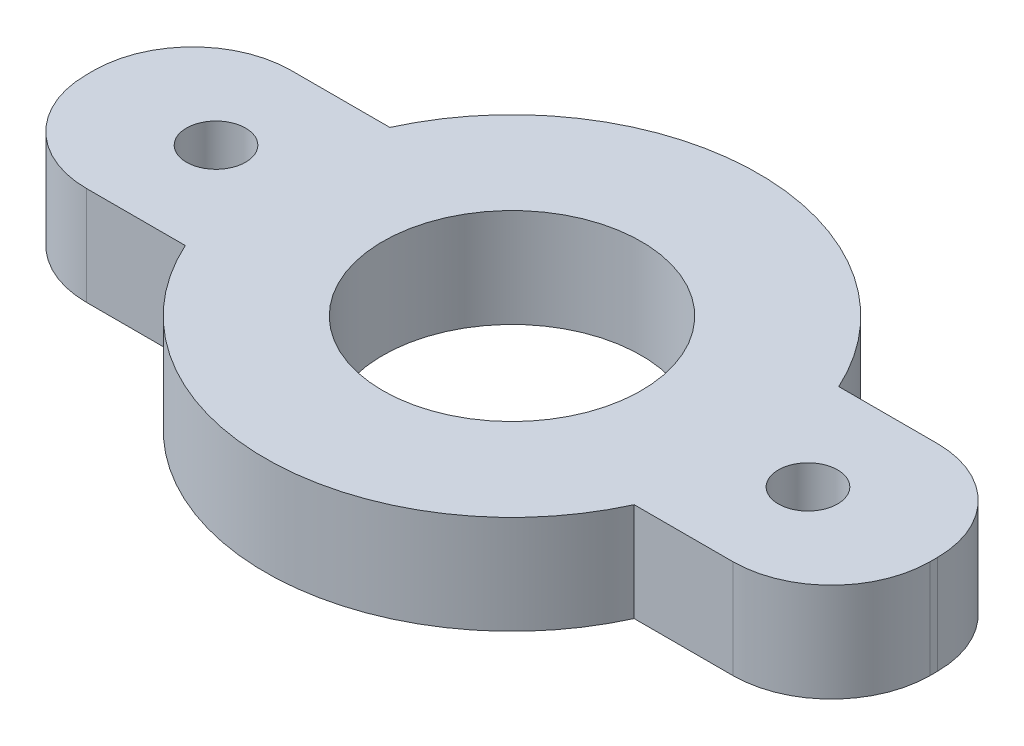
ISO-10303-21;
HEADER;
FILE_DESCRIPTION(('STEP AP214'),'2;1');
FILE_NAME('part.step','',(''),(''),'','','');
FILE_SCHEMA(('AUTOMOTIVE_DESIGN { 1 0 10303 214 1 1 1 1 }'));
ENDSEC;
DATA;
#1=APPLICATION_CONTEXT('core data for automotive mechanical design processes');
#2=APPLICATION_PROTOCOL_DEFINITION('international standard','automotive_design',2000,#1);
#3=PRODUCT_CONTEXT('',#1,'mechanical');
#4=PRODUCT('Part','Part','',(#3));
#5=PRODUCT_RELATED_PRODUCT_CATEGORY('part','',(#4));
#6=PRODUCT_DEFINITION_FORMATION('','',#4);
#7=PRODUCT_DEFINITION_CONTEXT('part definition',#1,'design');
#8=PRODUCT_DEFINITION('design','',#6,#7);
#9=PRODUCT_DEFINITION_SHAPE('','',#8);
#10=(LENGTH_UNIT() NAMED_UNIT(*) SI_UNIT(.MILLI.,.METRE.));
#11=(NAMED_UNIT(*) PLANE_ANGLE_UNIT() SI_UNIT($,.RADIAN.));
#12=(NAMED_UNIT(*) SI_UNIT($,.STERADIAN.) SOLID_ANGLE_UNIT());
#13=UNCERTAINTY_MEASURE_WITH_UNIT(LENGTH_MEASURE(1.E-05),#10,'distance_accuracy_value','');
#14=(GEOMETRIC_REPRESENTATION_CONTEXT(3) GLOBAL_UNCERTAINTY_ASSIGNED_CONTEXT((#13)) GLOBAL_UNIT_ASSIGNED_CONTEXT((#10,
#11,#12)) REPRESENTATION_CONTEXT('',''));
#15=CARTESIAN_POINT('',(0.,0.,0.));
#16=DIRECTION('',(0.,0.,1.));
#17=DIRECTION('',(1.,0.,0.));
#18=AXIS2_PLACEMENT_3D('',#15,#16,#17);
#19=CARTESIAN_POINT('',(0.,5.,0.));
#20=DIRECTION('',(0.,1.,0.));
#21=DIRECTION('',(0.,0.,1.));
#22=AXIS2_PLACEMENT_3D('',#19,#20,#21);
#23=PLANE('',#22);
#24=CARTESIAN_POINT('',(-15.,5.,0.));
#25=DIRECTION('',(0.,1.,0.));
#26=DIRECTION('',(0.,0.,1.));
#27=AXIS2_PLACEMENT_3D('',#24,#25,#26);
#28=CIRCLE('',#27,1.5);
#29=CARTESIAN_POINT('',(-15.,5.,1.5));
#30=VERTEX_POINT('',#29);
#31=EDGE_CURVE('E285',#30,#30,#28,.T.);
#32=ORIENTED_EDGE('',*,*,#31,.F.);
#33=EDGE_LOOP('',(#32));
#34=FACE_BOUND('',#33,.T.);
#35=CARTESIAN_POINT('',(0.,5.,0.));
#36=DIRECTION('',(0.,1.,0.));
#37=DIRECTION('',(0.,0.,1.));
#38=AXIS2_PLACEMENT_3D('',#35,#36,#37);
#39=CIRCLE('',#38,12.5);
#40=CARTESIAN_POINT('',(-11.3744844310577,5.,5.18373455412462));
#41=VERTEX_POINT('',#40);
#42=CARTESIAN_POINT('',(11.3744844310577,5.,5.18373455412462));
#43=VERTEX_POINT('',#42);
#44=EDGE_CURVE('E175',#41,#43,#39,.T.);
#45=ORIENTED_EDGE('',*,*,#44,.T.);
#46=DIRECTION('',(1.,0.,0.));
#47=VECTOR('',#46,1.);
#48=CARTESIAN_POINT('',(16.3744844310577,5.,5.18373455412462));
#49=LINE('',#48,#47);
#50=CARTESIAN_POINT('',(16.3744844310577,5.,5.18373455412462));
#51=VERTEX_POINT('',#50);
#52=EDGE_CURVE('E103',#43,#51,#49,.T.);
#53=ORIENTED_EDGE('',*,*,#52,.T.);
#54=CARTESIAN_POINT('',(16.3744844310577,5.,0.18373455412462));
#55=DIRECTION('',(0.,1.,0.));
#56=DIRECTION('',(0.,0.,-1.));
#57=AXIS2_PLACEMENT_3D('',#54,#55,#56);
#58=CIRCLE('',#57,5.);
#59=CARTESIAN_POINT('',(21.3744844310577,5.,0.183734554124619));
#60=VERTEX_POINT('',#59);
#61=EDGE_CURVE('E202',#51,#60,#58,.T.);
#62=ORIENTED_EDGE('',*,*,#61,.T.);
#63=DIRECTION('',(0.,0.,-1.));
#64=VECTOR('',#63,1.);
#65=CARTESIAN_POINT('',(21.3744844310577,5.,0.18373455412462));
#66=LINE('',#65,#64);
#67=CARTESIAN_POINT('',(21.3744844310577,5.,-0.183734554124614));
#68=VERTEX_POINT('',#67);
#69=EDGE_CURVE('E221',#60,#68,#66,.T.);
#70=ORIENTED_EDGE('',*,*,#69,.T.);
#71=CARTESIAN_POINT('',(16.3744844310577,5.,-0.183734554124614));
#72=DIRECTION('',(0.,1.,0.));
#73=DIRECTION('',(0.,0.,1.));
#74=AXIS2_PLACEMENT_3D('',#71,#72,#73);
#75=CIRCLE('',#74,5.);
#76=CARTESIAN_POINT('',(16.3744844310577,5.,-5.18373455412461));
#77=VERTEX_POINT('',#76);
#78=EDGE_CURVE('E218',#68,#77,#75,.T.);
#79=ORIENTED_EDGE('',*,*,#78,.T.);
#80=DIRECTION('',(-1.,0.,0.));
#81=VECTOR('',#80,1.);
#82=CARTESIAN_POINT('',(16.3744844310577,5.,-5.18373455412461));
#83=LINE('',#82,#81);
#84=CARTESIAN_POINT('',(11.3744844310577,5.,-5.18373455412462));
#85=VERTEX_POINT('',#84);
#86=EDGE_CURVE('E220',#77,#85,#83,.T.);
#87=ORIENTED_EDGE('',*,*,#86,.T.);
#88=CARTESIAN_POINT('',(0.,5.,0.));
#89=DIRECTION('',(0.,1.,0.));
#90=DIRECTION('',(0.,0.,1.));
#91=AXIS2_PLACEMENT_3D('',#88,#89,#90);
#92=CIRCLE('',#91,12.5);
#93=CARTESIAN_POINT('',(-11.3744844310577,5.,-5.18373455412462));
#94=VERTEX_POINT('',#93);
#95=EDGE_CURVE('E223',#85,#94,#92,.T.);
#96=ORIENTED_EDGE('',*,*,#95,.T.);
#97=DIRECTION('',(-1.,0.,0.));
#98=VECTOR('',#97,1.);
#99=CARTESIAN_POINT('',(-11.3744844310577,5.,-5.18373455412462));
#100=LINE('',#99,#98);
#101=CARTESIAN_POINT('',(-16.3744844310577,5.,-5.18373455412462));
#102=VERTEX_POINT('',#101);
#103=EDGE_CURVE('E229',#94,#102,#100,.T.);
#104=ORIENTED_EDGE('',*,*,#103,.T.);
#105=CARTESIAN_POINT('',(-16.3744844310577,5.,-0.183734554124623));
#106=DIRECTION('',(0.,1.,0.));
#107=DIRECTION('',(0.,0.,1.));
#108=AXIS2_PLACEMENT_3D('',#105,#106,#107);
#109=CIRCLE('',#108,5.);
#110=CARTESIAN_POINT('',(-21.3744844310577,5.,-0.183734554124624));
#111=VERTEX_POINT('',#110);
#112=EDGE_CURVE('E134',#102,#111,#109,.T.);
#113=ORIENTED_EDGE('',*,*,#112,.T.);
#114=DIRECTION('',(0.,0.,1.));
#115=VECTOR('',#114,1.);
#116=CARTESIAN_POINT('',(-21.3744844310577,5.,0.183734554124623));
#117=LINE('',#116,#115);
#118=CARTESIAN_POINT('',(-21.3744844310577,5.,0.183734554124623));
#119=VERTEX_POINT('',#118);
#120=EDGE_CURVE('E128',#111,#119,#117,.T.);
#121=ORIENTED_EDGE('',*,*,#120,.T.);
#122=CARTESIAN_POINT('',(-16.3744844310577,5.,0.183734554124623));
#123=DIRECTION('',(0.,1.,0.));
#124=DIRECTION('',(0.,0.,1.));
#125=AXIS2_PLACEMENT_3D('',#122,#123,#124);
#126=CIRCLE('',#125,5.);
#127=CARTESIAN_POINT('',(-16.3744844310577,5.,5.18373455412462));
#128=VERTEX_POINT('',#127);
#129=EDGE_CURVE('E132',#119,#128,#126,.T.);
#130=ORIENTED_EDGE('',*,*,#129,.T.);
#131=DIRECTION('',(1.,0.,0.));
#132=VECTOR('',#131,1.);
#133=CARTESIAN_POINT('',(-11.3744844310577,5.,5.18373455412462));
#134=LINE('',#133,#132);
#135=EDGE_CURVE('E48',#128,#41,#134,.T.);
#136=ORIENTED_EDGE('',*,*,#135,.T.);
#137=EDGE_LOOP('',(#45,#53,#62,#70,#79,#87,#96,#104,#113,#121,#130,#136));
#138=FACE_BOUND('',#137,.T.);
#139=CARTESIAN_POINT('',(0.,5.,0.));
#140=DIRECTION('',(0.,1.,0.));
#141=DIRECTION('',(0.,0.,1.));
#142=AXIS2_PLACEMENT_3D('',#139,#140,#141);
#143=CIRCLE('',#142,6.55);
#144=CARTESIAN_POINT('',(0.,5.,6.55));
#145=VERTEX_POINT('',#144);
#146=EDGE_CURVE('E156',#145,#145,#143,.T.);
#147=ORIENTED_EDGE('',*,*,#146,.F.);
#148=EDGE_LOOP('',(#147));
#149=FACE_BOUND('',#148,.T.);
#150=CARTESIAN_POINT('',(15.,5.,0.));
#151=DIRECTION('',(0.,1.,0.));
#152=DIRECTION('',(0.,0.,1.));
#153=AXIS2_PLACEMENT_3D('',#150,#151,#152);
#154=CIRCLE('',#153,1.5);
#155=CARTESIAN_POINT('',(15.,5.,1.5));
#156=VERTEX_POINT('',#155);
#157=EDGE_CURVE('E276',#156,#156,#154,.T.);
#158=ORIENTED_EDGE('',*,*,#157,.F.);
#159=EDGE_LOOP('',(#158));
#160=FACE_BOUND('',#159,.T.);
#161=ADVANCED_FACE('F31',(#34,#138,#149,#160),#23,.T.);
#162=CARTESIAN_POINT('',(0.,0.,0.));
#163=DIRECTION('',(0.,1.,0.));
#164=DIRECTION('',(0.,0.,1.));
#165=AXIS2_PLACEMENT_3D('',#162,#163,#164);
#166=PLANE('',#165);
#167=CARTESIAN_POINT('',(-15.,0.,0.));
#168=DIRECTION('',(0.,1.,0.));
#169=DIRECTION('',(0.,0.,1.));
#170=AXIS2_PLACEMENT_3D('',#167,#168,#169);
#171=CIRCLE('',#170,1.5);
#172=CARTESIAN_POINT('',(-15.,0.,1.5));
#173=VERTEX_POINT('',#172);
#174=EDGE_CURVE('E282',#173,#173,#171,.T.);
#175=ORIENTED_EDGE('',*,*,#174,.T.);
#176=EDGE_LOOP('',(#175));
#177=FACE_BOUND('',#176,.T.);
#178=CARTESIAN_POINT('',(0.,0.,0.));
#179=DIRECTION('',(0.,1.,0.));
#180=DIRECTION('',(0.,0.,1.));
#181=AXIS2_PLACEMENT_3D('',#178,#179,#180);
#182=CIRCLE('',#181,12.5);
#183=CARTESIAN_POINT('',(-11.3744844310577,0.,5.18373455412462));
#184=VERTEX_POINT('',#183);
#185=CARTESIAN_POINT('',(11.3744844310577,0.,5.18373455412462));
#186=VERTEX_POINT('',#185);
#187=EDGE_CURVE('E152',#184,#186,#182,.T.);
#188=ORIENTED_EDGE('',*,*,#187,.F.);
#189=DIRECTION('',(1.,0.,0.));
#190=VECTOR('',#189,1.);
#191=CARTESIAN_POINT('',(-11.3744844310577,0.,5.18373455412462));
#192=LINE('',#191,#190);
#193=CARTESIAN_POINT('',(-16.3744844310577,0.,5.18373455412462));
#194=VERTEX_POINT('',#193);
#195=EDGE_CURVE('E95',#194,#184,#192,.T.);
#196=ORIENTED_EDGE('',*,*,#195,.F.);
#197=CARTESIAN_POINT('',(-16.3744844310577,0.,0.183734554124623));
#198=DIRECTION('',(0.,1.,0.));
#199=DIRECTION('',(0.,0.,1.));
#200=AXIS2_PLACEMENT_3D('',#197,#198,#199);
#201=CIRCLE('',#200,5.);
#202=CARTESIAN_POINT('',(-21.3744844310577,0.,0.183734554124623));
#203=VERTEX_POINT('',#202);
#204=EDGE_CURVE('E89',#203,#194,#201,.T.);
#205=ORIENTED_EDGE('',*,*,#204,.F.);
#206=DIRECTION('',(0.,0.,1.));
#207=VECTOR('',#206,1.);
#208=CARTESIAN_POINT('',(-21.3744844310577,0.,0.183734554124623));
#209=LINE('',#208,#207);
#210=CARTESIAN_POINT('',(-21.3744844310577,0.,-0.183734554124624));
#211=VERTEX_POINT('',#210);
#212=EDGE_CURVE('E142',#211,#203,#209,.T.);
#213=ORIENTED_EDGE('',*,*,#212,.F.);
#214=CARTESIAN_POINT('',(-16.3744844310577,0.,-0.183734554124623));
#215=DIRECTION('',(0.,1.,0.));
#216=DIRECTION('',(0.,0.,1.));
#217=AXIS2_PLACEMENT_3D('',#214,#215,#216);
#218=CIRCLE('',#217,5.);
#219=CARTESIAN_POINT('',(-16.3744844310577,0.,-5.18373455412462));
#220=VERTEX_POINT('',#219);
#221=EDGE_CURVE('E170',#220,#211,#218,.T.);
#222=ORIENTED_EDGE('',*,*,#221,.F.);
#223=DIRECTION('',(-1.,0.,0.));
#224=VECTOR('',#223,1.);
#225=CARTESIAN_POINT('',(-11.3744844310577,0.,-5.18373455412462));
#226=LINE('',#225,#224);
#227=CARTESIAN_POINT('',(-11.3744844310577,0.,-5.18373455412462));
#228=VERTEX_POINT('',#227);
#229=EDGE_CURVE('E168',#228,#220,#226,.T.);
#230=ORIENTED_EDGE('',*,*,#229,.F.);
#231=CARTESIAN_POINT('',(0.,0.,0.));
#232=DIRECTION('',(0.,1.,0.));
#233=DIRECTION('',(0.,0.,1.));
#234=AXIS2_PLACEMENT_3D('',#231,#232,#233);
#235=CIRCLE('',#234,12.5);
#236=CARTESIAN_POINT('',(11.3744844310577,0.,-5.18373455412462));
#237=VERTEX_POINT('',#236);
#238=EDGE_CURVE('E166',#237,#228,#235,.T.);
#239=ORIENTED_EDGE('',*,*,#238,.F.);
#240=DIRECTION('',(-1.,0.,0.));
#241=VECTOR('',#240,1.);
#242=CARTESIAN_POINT('',(16.3744844310577,0.,-5.18373455412461));
#243=LINE('',#242,#241);
#244=CARTESIAN_POINT('',(16.3744844310577,0.,-5.18373455412461));
#245=VERTEX_POINT('',#244);
#246=EDGE_CURVE('E164',#245,#237,#243,.T.);
#247=ORIENTED_EDGE('',*,*,#246,.F.);
#248=CARTESIAN_POINT('',(16.3744844310577,0.,-0.183734554124614));
#249=DIRECTION('',(0.,1.,0.));
#250=DIRECTION('',(0.,0.,1.));
#251=AXIS2_PLACEMENT_3D('',#248,#249,#250);
#252=CIRCLE('',#251,5.);
#253=CARTESIAN_POINT('',(21.3744844310577,0.,-0.183734554124614));
#254=VERTEX_POINT('',#253);
#255=EDGE_CURVE('E162',#254,#245,#252,.T.);
#256=ORIENTED_EDGE('',*,*,#255,.F.);
#257=DIRECTION('',(0.,0.,-1.));
#258=VECTOR('',#257,1.);
#259=CARTESIAN_POINT('',(21.3744844310577,0.,0.18373455412462));
#260=LINE('',#259,#258);
#261=CARTESIAN_POINT('',(21.3744844310577,0.,0.183734554124619));
#262=VERTEX_POINT('',#261);
#263=EDGE_CURVE('E160',#262,#254,#260,.T.);
#264=ORIENTED_EDGE('',*,*,#263,.F.);
#265=CARTESIAN_POINT('',(16.3744844310577,0.,0.18373455412462));
#266=DIRECTION('',(0.,1.,0.));
#267=DIRECTION('',(0.,0.,-1.));
#268=AXIS2_PLACEMENT_3D('',#265,#266,#267);
#269=CIRCLE('',#268,5.);
#270=CARTESIAN_POINT('',(16.3744844310577,0.,5.18373455412462));
#271=VERTEX_POINT('',#270);
#272=EDGE_CURVE('E158',#271,#262,#269,.T.);
#273=ORIENTED_EDGE('',*,*,#272,.F.);
#274=DIRECTION('',(1.,0.,0.));
#275=VECTOR('',#274,1.);
#276=CARTESIAN_POINT('',(16.3744844310577,0.,5.18373455412462));
#277=LINE('',#276,#275);
#278=EDGE_CURVE('E155',#186,#271,#277,.T.);
#279=ORIENTED_EDGE('',*,*,#278,.F.);
#280=EDGE_LOOP('',(#188,#196,#205,#213,#222,#230,#239,#247,#256,#264,#273,#279));
#281=FACE_BOUND('',#280,.T.);
#282=CARTESIAN_POINT('',(0.,0.,0.));
#283=DIRECTION('',(0.,1.,0.));
#284=DIRECTION('',(0.,0.,1.));
#285=AXIS2_PLACEMENT_3D('',#282,#283,#284);
#286=CIRCLE('',#285,6.55);
#287=CARTESIAN_POINT('',(0.,0.,6.55));
#288=VERTEX_POINT('',#287);
#289=EDGE_CURVE('E288',#288,#288,#286,.T.);
#290=ORIENTED_EDGE('',*,*,#289,.T.);
#291=EDGE_LOOP('',(#290));
#292=FACE_BOUND('',#291,.T.);
#293=CARTESIAN_POINT('',(15.,0.,0.));
#294=DIRECTION('',(0.,1.,0.));
#295=DIRECTION('',(0.,0.,1.));
#296=AXIS2_PLACEMENT_3D('',#293,#294,#295);
#297=CIRCLE('',#296,1.5);
#298=CARTESIAN_POINT('',(15.,0.,1.5));
#299=VERTEX_POINT('',#298);
#300=EDGE_CURVE('E279',#299,#299,#297,.T.);
#301=ORIENTED_EDGE('',*,*,#300,.T.);
#302=EDGE_LOOP('',(#301));
#303=FACE_BOUND('',#302,.T.);
#304=ADVANCED_FACE('F206',(#177,#281,#292,#303),#166,.F.);
#305=CARTESIAN_POINT('',(0.,5.,0.));
#306=DIRECTION('',(0.,-1.,0.));
#307=DIRECTION('',(0.,0.,-1.));
#308=AXIS2_PLACEMENT_3D('',#305,#306,#307);
#309=CYLINDRICAL_SURFACE('',#308,12.5);
#310=ORIENTED_EDGE('',*,*,#187,.T.);
#311=DIRECTION('',(0.,-1.,0.));
#312=VECTOR('',#311,1.);
#313=CARTESIAN_POINT('',(11.3744844310577,5.,5.18373455412462));
#314=LINE('',#313,#312);
#315=EDGE_CURVE('E11',#43,#186,#314,.T.);
#316=ORIENTED_EDGE('',*,*,#315,.F.);
#317=ORIENTED_EDGE('',*,*,#44,.F.);
#318=DIRECTION('',(0.,-1.,0.));
#319=VECTOR('',#318,1.);
#320=CARTESIAN_POINT('',(-11.3744844310577,5.,5.18373455412462));
#321=LINE('',#320,#319);
#322=EDGE_CURVE('E148',#41,#184,#321,.T.);
#323=ORIENTED_EDGE('',*,*,#322,.T.);
#324=EDGE_LOOP('',(#310,#316,#317,#323));
#325=FACE_BOUND('',#324,.T.);
#326=ADVANCED_FACE('F33',(#325),#309,.T.);
#327=CARTESIAN_POINT('',(16.3744844310577,5.,5.18373455412462));
#328=DIRECTION('',(0.,0.,-1.));
#329=DIRECTION('',(-1.,0.,0.));
#330=AXIS2_PLACEMENT_3D('',#327,#328,#329);
#331=PLANE('',#330);
#332=ORIENTED_EDGE('',*,*,#278,.T.);
#333=DIRECTION('',(0.,-1.,0.));
#334=VECTOR('',#333,1.);
#335=CARTESIAN_POINT('',(16.3744844310577,5.,5.18373455412462));
#336=LINE('',#335,#334);
#337=EDGE_CURVE('E40',#51,#271,#336,.T.);
#338=ORIENTED_EDGE('',*,*,#337,.F.);
#339=ORIENTED_EDGE('',*,*,#52,.F.);
#340=ORIENTED_EDGE('',*,*,#315,.T.);
#341=EDGE_LOOP('',(#332,#338,#339,#340));
#342=FACE_BOUND('',#341,.T.);
#343=ADVANCED_FACE('F389',(#342),#331,.F.);
#344=CARTESIAN_POINT('',(16.3744844310577,5.,0.18373455412462));
#345=DIRECTION('',(0.,-1.,0.));
#346=DIRECTION('',(0.,0.,-1.));
#347=AXIS2_PLACEMENT_3D('',#344,#345,#346);
#348=CYLINDRICAL_SURFACE('',#347,5.);
#349=ORIENTED_EDGE('',*,*,#272,.T.);
#350=DIRECTION('',(0.,-1.,0.));
#351=VECTOR('',#350,1.);
#352=CARTESIAN_POINT('',(21.3744844310577,5.,0.183734554124619));
#353=LINE('',#352,#351);
#354=EDGE_CURVE('E194',#60,#262,#353,.T.);
#355=ORIENTED_EDGE('',*,*,#354,.F.);
#356=ORIENTED_EDGE('',*,*,#61,.F.);
#357=ORIENTED_EDGE('',*,*,#337,.T.);
#358=EDGE_LOOP('',(#349,#355,#356,#357));
#359=FACE_BOUND('',#358,.T.);
#360=ADVANCED_FACE('F200',(#359),#348,.T.);
#361=CARTESIAN_POINT('',(21.3744844310577,5.,0.18373455412462));
#362=DIRECTION('',(-1.,0.,0.));
#363=DIRECTION('',(0.,0.,1.));
#364=AXIS2_PLACEMENT_3D('',#361,#362,#363);
#365=PLANE('',#364);
#366=ORIENTED_EDGE('',*,*,#263,.T.);
#367=DIRECTION('',(0.,-1.,0.));
#368=VECTOR('',#367,1.);
#369=CARTESIAN_POINT('',(21.3744844310577,5.,-0.183734554124614));
#370=LINE('',#369,#368);
#371=EDGE_CURVE('E191',#68,#254,#370,.T.);
#372=ORIENTED_EDGE('',*,*,#371,.F.);
#373=ORIENTED_EDGE('',*,*,#69,.F.);
#374=ORIENTED_EDGE('',*,*,#354,.T.);
#375=EDGE_LOOP('',(#366,#372,#373,#374));
#376=FACE_BOUND('',#375,.T.);
#377=ADVANCED_FACE('F212',(#376),#365,.F.);
#378=CARTESIAN_POINT('',(16.3744844310577,5.,-0.183734554124614));
#379=DIRECTION('',(0.,-1.,0.));
#380=DIRECTION('',(0.,0.,-1.));
#381=AXIS2_PLACEMENT_3D('',#378,#379,#380);
#382=CYLINDRICAL_SURFACE('',#381,5.);
#383=ORIENTED_EDGE('',*,*,#255,.T.);
#384=DIRECTION('',(0.,-1.,0.));
#385=VECTOR('',#384,1.);
#386=CARTESIAN_POINT('',(16.3744844310577,5.,-5.18373455412461));
#387=LINE('',#386,#385);
#388=EDGE_CURVE('E188',#77,#245,#387,.T.);
#389=ORIENTED_EDGE('',*,*,#388,.F.);
#390=ORIENTED_EDGE('',*,*,#78,.F.);
#391=ORIENTED_EDGE('',*,*,#371,.T.);
#392=EDGE_LOOP('',(#383,#389,#390,#391));
#393=FACE_BOUND('',#392,.T.);
#394=ADVANCED_FACE('F216',(#393),#382,.T.);
#395=CARTESIAN_POINT('',(16.3744844310577,5.,-5.18373455412461));
#396=DIRECTION('',(0.,0.,1.));
#397=DIRECTION('',(1.,0.,0.));
#398=AXIS2_PLACEMENT_3D('',#395,#396,#397);
#399=PLANE('',#398);
#400=ORIENTED_EDGE('',*,*,#246,.T.);
#401=DIRECTION('',(0.,-1.,0.));
#402=VECTOR('',#401,1.);
#403=CARTESIAN_POINT('',(11.3744844310577,5.,-5.18373455412462));
#404=LINE('',#403,#402);
#405=EDGE_CURVE('E185',#85,#237,#404,.T.);
#406=ORIENTED_EDGE('',*,*,#405,.F.);
#407=ORIENTED_EDGE('',*,*,#86,.F.);
#408=ORIENTED_EDGE('',*,*,#388,.T.);
#409=EDGE_LOOP('',(#400,#406,#407,#408));
#410=FACE_BOUND('',#409,.T.);
#411=ADVANCED_FACE('F354',(#410),#399,.F.);
#412=CARTESIAN_POINT('',(0.,5.,0.));
#413=DIRECTION('',(0.,-1.,0.));
#414=DIRECTION('',(0.,0.,-1.));
#415=AXIS2_PLACEMENT_3D('',#412,#413,#414);
#416=CYLINDRICAL_SURFACE('',#415,12.5);
#417=ORIENTED_EDGE('',*,*,#238,.T.);
#418=DIRECTION('',(0.,-1.,0.));
#419=VECTOR('',#418,1.);
#420=CARTESIAN_POINT('',(-11.3744844310577,5.,-5.18373455412462));
#421=LINE('',#420,#419);
#422=EDGE_CURVE('E182',#94,#228,#421,.T.);
#423=ORIENTED_EDGE('',*,*,#422,.F.);
#424=ORIENTED_EDGE('',*,*,#95,.F.);
#425=ORIENTED_EDGE('',*,*,#405,.T.);
#426=EDGE_LOOP('',(#417,#423,#424,#425));
#427=FACE_BOUND('',#426,.T.);
#428=ADVANCED_FACE('F345',(#427),#416,.T.);
#429=CARTESIAN_POINT('',(-11.3744844310577,5.,-5.18373455412462));
#430=DIRECTION('',(0.,0.,1.));
#431=DIRECTION('',(1.,0.,0.));
#432=AXIS2_PLACEMENT_3D('',#429,#430,#431);
#433=PLANE('',#432);
#434=ORIENTED_EDGE('',*,*,#229,.T.);
#435=DIRECTION('',(0.,-1.,0.));
#436=VECTOR('',#435,1.);
#437=CARTESIAN_POINT('',(-16.3744844310577,5.,-5.18373455412462));
#438=LINE('',#437,#436);
#439=EDGE_CURVE('E179',#102,#220,#438,.T.);
#440=ORIENTED_EDGE('',*,*,#439,.F.);
#441=ORIENTED_EDGE('',*,*,#103,.F.);
#442=ORIENTED_EDGE('',*,*,#422,.T.);
#443=EDGE_LOOP('',(#434,#440,#441,#442));
#444=FACE_BOUND('',#443,.T.);
#445=ADVANCED_FACE('F235',(#444),#433,.F.);
#446=CARTESIAN_POINT('',(-16.3744844310577,5.,-0.183734554124623));
#447=DIRECTION('',(0.,-1.,0.));
#448=DIRECTION('',(0.,0.,-1.));
#449=AXIS2_PLACEMENT_3D('',#446,#447,#448);
#450=CYLINDRICAL_SURFACE('',#449,5.);
#451=ORIENTED_EDGE('',*,*,#221,.T.);
#452=DIRECTION('',(0.,-1.,0.));
#453=VECTOR('',#452,1.);
#454=CARTESIAN_POINT('',(-21.3744844310577,5.,-0.183734554124624));
#455=LINE('',#454,#453);
#456=EDGE_CURVE('E143',#111,#211,#455,.T.);
#457=ORIENTED_EDGE('',*,*,#456,.F.);
#458=ORIENTED_EDGE('',*,*,#112,.F.);
#459=ORIENTED_EDGE('',*,*,#439,.T.);
#460=EDGE_LOOP('',(#451,#457,#458,#459));
#461=FACE_BOUND('',#460,.T.);
#462=ADVANCED_FACE('F239',(#461),#450,.T.);
#463=CARTESIAN_POINT('',(-21.3744844310577,5.,0.183734554124623));
#464=DIRECTION('',(1.,0.,0.));
#465=DIRECTION('',(0.,0.,-1.));
#466=AXIS2_PLACEMENT_3D('',#463,#464,#465);
#467=PLANE('',#466);
#468=ORIENTED_EDGE('',*,*,#212,.T.);
#469=DIRECTION('',(0.,-1.,0.));
#470=VECTOR('',#469,1.);
#471=CARTESIAN_POINT('',(-21.3744844310577,5.,0.183734554124623));
#472=LINE('',#471,#470);
#473=EDGE_CURVE('E139',#119,#203,#472,.T.);
#474=ORIENTED_EDGE('',*,*,#473,.F.);
#475=ORIENTED_EDGE('',*,*,#120,.F.);
#476=ORIENTED_EDGE('',*,*,#456,.T.);
#477=EDGE_LOOP('',(#468,#474,#475,#476));
#478=FACE_BOUND('',#477,.T.);
#479=ADVANCED_FACE('F140',(#478),#467,.F.);
#480=CARTESIAN_POINT('',(-16.3744844310577,5.,0.183734554124623));
#481=DIRECTION('',(0.,-1.,0.));
#482=DIRECTION('',(0.,0.,-1.));
#483=AXIS2_PLACEMENT_3D('',#480,#481,#482);
#484=CYLINDRICAL_SURFACE('',#483,5.);
#485=ORIENTED_EDGE('',*,*,#204,.T.);
#486=DIRECTION('',(0.,-1.,0.));
#487=VECTOR('',#486,1.);
#488=CARTESIAN_POINT('',(-16.3744844310577,5.,5.18373455412462));
#489=LINE('',#488,#487);
#490=EDGE_CURVE('E144',#128,#194,#489,.T.);
#491=ORIENTED_EDGE('',*,*,#490,.F.);
#492=ORIENTED_EDGE('',*,*,#129,.F.);
#493=ORIENTED_EDGE('',*,*,#473,.T.);
#494=EDGE_LOOP('',(#485,#491,#492,#493));
#495=FACE_BOUND('',#494,.T.);
#496=ADVANCED_FACE('F146',(#495),#484,.T.);
#497=CARTESIAN_POINT('',(-11.3744844310577,5.,5.18373455412462));
#498=DIRECTION('',(0.,0.,-1.));
#499=DIRECTION('',(-1.,0.,0.));
#500=AXIS2_PLACEMENT_3D('',#497,#498,#499);
#501=PLANE('',#500);
#502=ORIENTED_EDGE('',*,*,#195,.T.);
#503=ORIENTED_EDGE('',*,*,#322,.F.);
#504=ORIENTED_EDGE('',*,*,#135,.F.);
#505=ORIENTED_EDGE('',*,*,#490,.T.);
#506=EDGE_LOOP('',(#502,#503,#504,#505));
#507=FACE_BOUND('',#506,.T.);
#508=ADVANCED_FACE('F243',(#507),#501,.F.);
#509=CARTESIAN_POINT('',(0.,5.,0.));
#510=DIRECTION('',(0.,-1.,0.));
#511=DIRECTION('',(0.,0.,-1.));
#512=AXIS2_PLACEMENT_3D('',#509,#510,#511);
#513=CYLINDRICAL_SURFACE('',#512,6.55);
#514=ORIENTED_EDGE('',*,*,#146,.T.);
#515=EDGE_LOOP('',(#514));
#516=FACE_BOUND('',#515,.T.);
#517=ORIENTED_EDGE('',*,*,#289,.F.);
#518=EDGE_LOOP('',(#517));
#519=FACE_BOUND('',#518,.T.);
#520=ADVANCED_FACE('F245',(#516,#519),#513,.F.);
#521=CARTESIAN_POINT('',(-15.,5.,0.));
#522=DIRECTION('',(0.,-1.,0.));
#523=DIRECTION('',(0.,0.,-1.));
#524=AXIS2_PLACEMENT_3D('',#521,#522,#523);
#525=CYLINDRICAL_SURFACE('',#524,1.5);
#526=ORIENTED_EDGE('',*,*,#31,.T.);
#527=EDGE_LOOP('',(#526));
#528=FACE_BOUND('',#527,.T.);
#529=ORIENTED_EDGE('',*,*,#174,.F.);
#530=EDGE_LOOP('',(#529));
#531=FACE_BOUND('',#530,.T.);
#532=ADVANCED_FACE('F251',(#528,#531),#525,.F.);
#533=CARTESIAN_POINT('',(15.,5.,0.));
#534=DIRECTION('',(0.,-1.,0.));
#535=DIRECTION('',(0.,0.,-1.));
#536=AXIS2_PLACEMENT_3D('',#533,#534,#535);
#537=CYLINDRICAL_SURFACE('',#536,1.5);
#538=ORIENTED_EDGE('',*,*,#157,.T.);
#539=EDGE_LOOP('',(#538));
#540=FACE_BOUND('',#539,.T.);
#541=ORIENTED_EDGE('',*,*,#300,.F.);
#542=EDGE_LOOP('',(#541));
#543=FACE_BOUND('',#542,.T.);
#544=ADVANCED_FACE('F267',(#540,#543),#537,.F.);
#545=CLOSED_SHELL('',(#161,#304,#326,#343,#360,#377,#394,#411,#428,#445,#462,#479,#496,#508,
#520,#532,#544));
#546=MANIFOLD_SOLID_BREP('B2',#545);
#547=ADVANCED_BREP_SHAPE_REPRESENTATION('',(#18,#546),#14);
#548=SHAPE_DEFINITION_REPRESENTATION(#9,#547);
ENDSEC;
END-ISO-10303-21;
